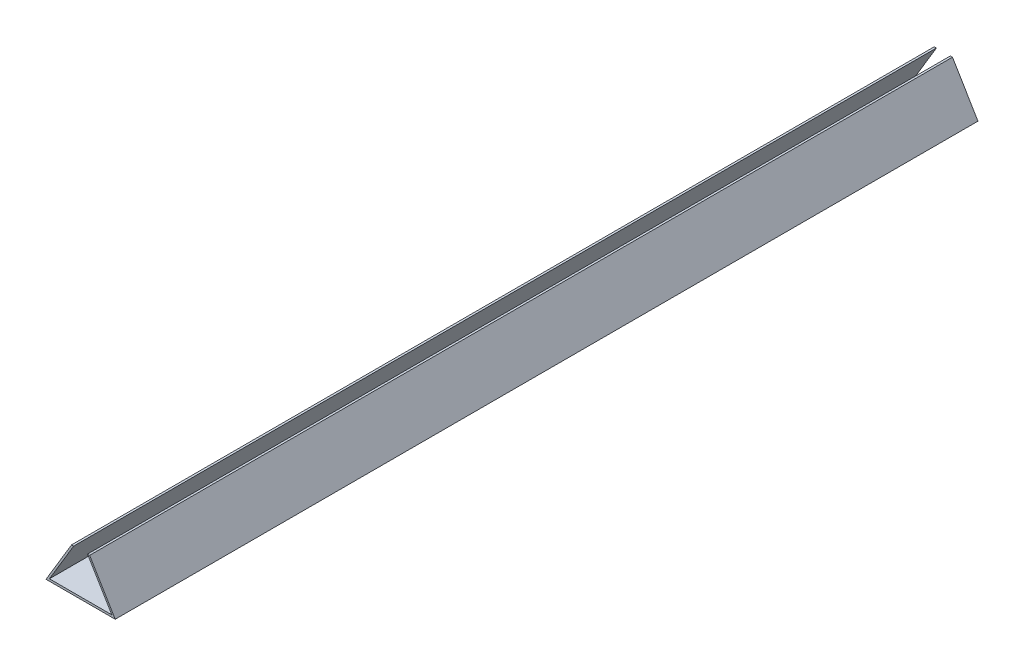
ISO-10303-21;
HEADER;
FILE_DESCRIPTION(('STEP AP214'),'2;1');
FILE_NAME('part.step','',(''),(''),'','','');
FILE_SCHEMA(('AUTOMOTIVE_DESIGN { 1 0 10303 214 1 1 1 1 }'));
ENDSEC;
DATA;
#1=APPLICATION_CONTEXT('core data for automotive mechanical design processes');
#2=APPLICATION_PROTOCOL_DEFINITION('international standard','automotive_design',2000,#1);
#3=PRODUCT_CONTEXT('',#1,'mechanical');
#4=PRODUCT('Part','Part','',(#3));
#5=PRODUCT_RELATED_PRODUCT_CATEGORY('part','',(#4));
#6=PRODUCT_DEFINITION_FORMATION('','',#4);
#7=PRODUCT_DEFINITION_CONTEXT('part definition',#1,'design');
#8=PRODUCT_DEFINITION('design','',#6,#7);
#9=PRODUCT_DEFINITION_SHAPE('','',#8);
#10=(LENGTH_UNIT() NAMED_UNIT(*) SI_UNIT(.MILLI.,.METRE.));
#11=(NAMED_UNIT(*) PLANE_ANGLE_UNIT() SI_UNIT($,.RADIAN.));
#12=(NAMED_UNIT(*) SI_UNIT($,.STERADIAN.) SOLID_ANGLE_UNIT());
#13=UNCERTAINTY_MEASURE_WITH_UNIT(LENGTH_MEASURE(1.E-05),#10,'distance_accuracy_value','');
#14=(GEOMETRIC_REPRESENTATION_CONTEXT(3) GLOBAL_UNCERTAINTY_ASSIGNED_CONTEXT((#13)) GLOBAL_UNIT_ASSIGNED_CONTEXT((#10,
#11,#12)) REPRESENTATION_CONTEXT('',''));
#15=CARTESIAN_POINT('',(0.,0.,0.));
#16=DIRECTION('',(0.,0.,1.));
#17=DIRECTION('',(1.,0.,0.));
#18=AXIS2_PLACEMENT_3D('',#15,#16,#17);
#19=CARTESIAN_POINT('',(-32.5,0.,810.));
#20=DIRECTION('',(0.857492925712544,-0.514495755427526,0.));
#21=DIRECTION('',(0.514495755427526,0.857492925712544,0.));
#22=AXIS2_PLACEMENT_3D('',#19,#20,#21);
#23=PLANE('',#22);
#24=DIRECTION('',(-0.514495755427526,-0.857492925712544,0.));
#25=VECTOR('',#24,1.);
#26=CARTESIAN_POINT('',(-32.5,0.,0.));
#27=LINE('',#26,#25);
#28=CARTESIAN_POINT('',(-8.5,40.,0.));
#29=VERTEX_POINT('',#28);
#30=CARTESIAN_POINT('',(-32.5,0.,0.));
#31=VERTEX_POINT('',#30);
#32=EDGE_CURVE('E129',#29,#31,#27,.T.);
#33=ORIENTED_EDGE('',*,*,#32,.T.);
#34=DIRECTION('',(0.,0.,-1.));
#35=VECTOR('',#34,1.);
#36=CARTESIAN_POINT('',(-32.5,0.,810.));
#37=LINE('',#36,#35);
#38=CARTESIAN_POINT('',(-32.5,0.,810.));
#39=VERTEX_POINT('',#38);
#40=EDGE_CURVE('E11',#39,#31,#37,.T.);
#41=ORIENTED_EDGE('',*,*,#40,.F.);
#42=DIRECTION('',(-0.514495755427526,-0.857492925712544,0.));
#43=VECTOR('',#42,1.);
#44=CARTESIAN_POINT('',(-32.5,0.,810.));
#45=LINE('',#44,#43);
#46=CARTESIAN_POINT('',(-8.5,40.,810.));
#47=VERTEX_POINT('',#46);
#48=EDGE_CURVE('E143',#47,#39,#45,.T.);
#49=ORIENTED_EDGE('',*,*,#48,.F.);
#50=DIRECTION('',(0.,0.,-1.));
#51=VECTOR('',#50,1.);
#52=CARTESIAN_POINT('',(-8.5,40.,810.));
#53=LINE('',#52,#51);
#54=EDGE_CURVE('E125',#47,#29,#53,.T.);
#55=ORIENTED_EDGE('',*,*,#54,.T.);
#56=EDGE_LOOP('',(#33,#41,#49,#55));
#57=FACE_BOUND('',#56,.T.);
#58=ADVANCED_FACE('F33',(#57),#23,.F.);
#59=CARTESIAN_POINT('',(-32.5,0.,810.));
#60=DIRECTION('',(0.,1.,0.));
#61=DIRECTION('',(0.,0.,1.));
#62=AXIS2_PLACEMENT_3D('',#59,#60,#61);
#63=PLANE('',#62);
#64=DIRECTION('',(1.,0.,0.));
#65=VECTOR('',#64,1.);
#66=CARTESIAN_POINT('',(-32.5,0.,0.));
#67=LINE('',#66,#65);
#68=CARTESIAN_POINT('',(32.5,0.,0.));
#69=VERTEX_POINT('',#68);
#70=EDGE_CURVE('E132',#31,#69,#67,.T.);
#71=ORIENTED_EDGE('',*,*,#70,.T.);
#72=DIRECTION('',(0.,0.,-1.));
#73=VECTOR('',#72,1.);
#74=CARTESIAN_POINT('',(32.5,0.,810.));
#75=LINE('',#74,#73);
#76=CARTESIAN_POINT('',(32.5,0.,810.));
#77=VERTEX_POINT('',#76);
#78=EDGE_CURVE('E41',#77,#69,#75,.T.);
#79=ORIENTED_EDGE('',*,*,#78,.F.);
#80=DIRECTION('',(1.,0.,0.));
#81=VECTOR('',#80,1.);
#82=CARTESIAN_POINT('',(-32.5,0.,810.));
#83=LINE('',#82,#81);
#84=EDGE_CURVE('E92',#39,#77,#83,.T.);
#85=ORIENTED_EDGE('',*,*,#84,.F.);
#86=ORIENTED_EDGE('',*,*,#40,.T.);
#87=EDGE_LOOP('',(#71,#79,#85,#86));
#88=FACE_BOUND('',#87,.T.);
#89=ADVANCED_FACE('F178',(#88),#63,.F.);
#90=CARTESIAN_POINT('',(32.5,0.,810.));
#91=DIRECTION('',(-0.857492925712544,-0.514495755427527,0.));
#92=DIRECTION('',(0.514495755427527,-0.857492925712544,0.));
#93=AXIS2_PLACEMENT_3D('',#90,#91,#92);
#94=PLANE('',#93);
#95=DIRECTION('',(-0.514495755427527,0.857492925712544,0.));
#96=VECTOR('',#95,1.);
#97=CARTESIAN_POINT('',(32.5,0.,0.));
#98=LINE('',#97,#96);
#99=CARTESIAN_POINT('',(8.5,40.,0.));
#100=VERTEX_POINT('',#99);
#101=EDGE_CURVE('E134',#69,#100,#98,.T.);
#102=ORIENTED_EDGE('',*,*,#101,.T.);
#103=DIRECTION('',(0.,0.,-1.));
#104=VECTOR('',#103,1.);
#105=CARTESIAN_POINT('',(8.5,40.,810.));
#106=LINE('',#105,#104);
#107=CARTESIAN_POINT('',(8.5,40.,810.));
#108=VERTEX_POINT('',#107);
#109=EDGE_CURVE('E150',#108,#100,#106,.T.);
#110=ORIENTED_EDGE('',*,*,#109,.F.);
#111=DIRECTION('',(-0.514495755427527,0.857492925712544,0.));
#112=VECTOR('',#111,1.);
#113=CARTESIAN_POINT('',(32.5,0.,810.));
#114=LINE('',#113,#112);
#115=EDGE_CURVE('E158',#77,#108,#114,.T.);
#116=ORIENTED_EDGE('',*,*,#115,.F.);
#117=ORIENTED_EDGE('',*,*,#78,.T.);
#118=EDGE_LOOP('',(#102,#110,#116,#117));
#119=FACE_BOUND('',#118,.T.);
#120=ADVANCED_FACE('F156',(#119),#94,.F.);
#121=CARTESIAN_POINT('',(6.5,40.,810.));
#122=DIRECTION('',(0.,-1.,0.));
#123=DIRECTION('',(0.,0.,-1.));
#124=AXIS2_PLACEMENT_3D('',#121,#122,#123);
#125=PLANE('',#124);
#126=DIRECTION('',(-1.,0.,0.));
#127=VECTOR('',#126,1.);
#128=CARTESIAN_POINT('',(6.5,40.,0.));
#129=LINE('',#128,#127);
#130=CARTESIAN_POINT('',(6.5,40.,0.));
#131=VERTEX_POINT('',#130);
#132=EDGE_CURVE('E136',#100,#131,#129,.T.);
#133=ORIENTED_EDGE('',*,*,#132,.T.);
#134=DIRECTION('',(0.,0.,-1.));
#135=VECTOR('',#134,1.);
#136=CARTESIAN_POINT('',(6.5,40.,810.));
#137=LINE('',#136,#135);
#138=CARTESIAN_POINT('',(6.5,40.,810.));
#139=VERTEX_POINT('',#138);
#140=EDGE_CURVE('E147',#139,#131,#137,.T.);
#141=ORIENTED_EDGE('',*,*,#140,.F.);
#142=DIRECTION('',(-1.,0.,0.));
#143=VECTOR('',#142,1.);
#144=CARTESIAN_POINT('',(6.5,40.,810.));
#145=LINE('',#144,#143);
#146=EDGE_CURVE('E170',#108,#139,#145,.T.);
#147=ORIENTED_EDGE('',*,*,#146,.F.);
#148=ORIENTED_EDGE('',*,*,#109,.T.);
#149=EDGE_LOOP('',(#133,#141,#147,#148));
#150=FACE_BOUND('',#149,.T.);
#151=ADVANCED_FACE('F166',(#150),#125,.F.);
#152=CARTESIAN_POINT('',(29.3,2.,810.));
#153=DIRECTION('',(0.857492925712544,0.514495755427527,0.));
#154=DIRECTION('',(-0.514495755427527,0.857492925712544,0.));
#155=AXIS2_PLACEMENT_3D('',#152,#153,#154);
#156=PLANE('',#155);
#157=DIRECTION('',(0.514495755427527,-0.857492925712544,0.));
#158=VECTOR('',#157,1.);
#159=CARTESIAN_POINT('',(29.3,2.,0.));
#160=LINE('',#159,#158);
#161=CARTESIAN_POINT('',(29.3,2.,0.));
#162=VERTEX_POINT('',#161);
#163=EDGE_CURVE('E138',#131,#162,#160,.T.);
#164=ORIENTED_EDGE('',*,*,#163,.T.);
#165=DIRECTION('',(0.,0.,-1.));
#166=VECTOR('',#165,1.);
#167=CARTESIAN_POINT('',(29.3,2.,810.));
#168=LINE('',#167,#166);
#169=CARTESIAN_POINT('',(29.3,2.,810.));
#170=VERTEX_POINT('',#169);
#171=EDGE_CURVE('E120',#170,#162,#168,.T.);
#172=ORIENTED_EDGE('',*,*,#171,.F.);
#173=DIRECTION('',(0.514495755427527,-0.857492925712544,0.));
#174=VECTOR('',#173,1.);
#175=CARTESIAN_POINT('',(29.3,2.,810.));
#176=LINE('',#175,#174);
#177=EDGE_CURVE('E111',#139,#170,#176,.T.);
#178=ORIENTED_EDGE('',*,*,#177,.F.);
#179=ORIENTED_EDGE('',*,*,#140,.T.);
#180=EDGE_LOOP('',(#164,#172,#178,#179));
#181=FACE_BOUND('',#180,.T.);
#182=ADVANCED_FACE('F169',(#181),#156,.F.);
#183=CARTESIAN_POINT('',(-29.3,2.,810.));
#184=DIRECTION('',(0.,-1.,0.));
#185=DIRECTION('',(0.,0.,-1.));
#186=AXIS2_PLACEMENT_3D('',#183,#184,#185);
#187=PLANE('',#186);
#188=DIRECTION('',(-1.,0.,0.));
#189=VECTOR('',#188,1.);
#190=CARTESIAN_POINT('',(-29.3,2.,0.));
#191=LINE('',#190,#189);
#192=CARTESIAN_POINT('',(-29.3,2.,0.));
#193=VERTEX_POINT('',#192);
#194=EDGE_CURVE('E119',#162,#193,#191,.T.);
#195=ORIENTED_EDGE('',*,*,#194,.T.);
#196=DIRECTION('',(0.,0.,-1.));
#197=VECTOR('',#196,1.);
#198=CARTESIAN_POINT('',(-29.3,2.,810.));
#199=LINE('',#198,#197);
#200=CARTESIAN_POINT('',(-29.3,2.,810.));
#201=VERTEX_POINT('',#200);
#202=EDGE_CURVE('E116',#201,#193,#199,.T.);
#203=ORIENTED_EDGE('',*,*,#202,.F.);
#204=DIRECTION('',(-1.,0.,0.));
#205=VECTOR('',#204,1.);
#206=CARTESIAN_POINT('',(-29.3,2.,810.));
#207=LINE('',#206,#205);
#208=EDGE_CURVE('E105',#170,#201,#207,.T.);
#209=ORIENTED_EDGE('',*,*,#208,.F.);
#210=ORIENTED_EDGE('',*,*,#171,.T.);
#211=EDGE_LOOP('',(#195,#203,#209,#210));
#212=FACE_BOUND('',#211,.T.);
#213=ADVANCED_FACE('F117',(#212),#187,.F.);
#214=CARTESIAN_POINT('',(-6.50000000000001,40.,810.));
#215=DIRECTION('',(-0.857492925712544,0.514495755427526,0.));
#216=DIRECTION('',(-0.514495755427526,-0.857492925712544,0.));
#217=AXIS2_PLACEMENT_3D('',#214,#215,#216);
#218=PLANE('',#217);
#219=DIRECTION('',(0.514495755427526,0.857492925712544,0.));
#220=VECTOR('',#219,1.);
#221=CARTESIAN_POINT('',(-6.50000000000001,40.,0.));
#222=LINE('',#221,#220);
#223=CARTESIAN_POINT('',(-6.50000000000001,40.,0.));
#224=VERTEX_POINT('',#223);
#225=EDGE_CURVE('E78',#193,#224,#222,.T.);
#226=ORIENTED_EDGE('',*,*,#225,.T.);
#227=DIRECTION('',(0.,0.,-1.));
#228=VECTOR('',#227,1.);
#229=CARTESIAN_POINT('',(-6.50000000000001,40.,810.));
#230=LINE('',#229,#228);
#231=CARTESIAN_POINT('',(-6.50000000000001,40.,810.));
#232=VERTEX_POINT('',#231);
#233=EDGE_CURVE('E121',#232,#224,#230,.T.);
#234=ORIENTED_EDGE('',*,*,#233,.F.);
#235=DIRECTION('',(0.514495755427526,0.857492925712544,0.));
#236=VECTOR('',#235,1.);
#237=CARTESIAN_POINT('',(-6.50000000000001,40.,810.));
#238=LINE('',#237,#236);
#239=EDGE_CURVE('E109',#201,#232,#238,.T.);
#240=ORIENTED_EDGE('',*,*,#239,.F.);
#241=ORIENTED_EDGE('',*,*,#202,.T.);
#242=EDGE_LOOP('',(#226,#234,#240,#241));
#243=FACE_BOUND('',#242,.T.);
#244=ADVANCED_FACE('F123',(#243),#218,.F.);
#245=CARTESIAN_POINT('',(-6.50000000000001,40.,810.));
#246=DIRECTION('',(0.,-1.,0.));
#247=DIRECTION('',(0.,0.,-1.));
#248=AXIS2_PLACEMENT_3D('',#245,#246,#247);
#249=PLANE('',#248);
#250=DIRECTION('',(-1.,0.,0.));
#251=VECTOR('',#250,1.);
#252=CARTESIAN_POINT('',(-6.50000000000001,40.,0.));
#253=LINE('',#252,#251);
#254=EDGE_CURVE('E84',#224,#29,#253,.T.);
#255=ORIENTED_EDGE('',*,*,#254,.T.);
#256=ORIENTED_EDGE('',*,*,#54,.F.);
#257=DIRECTION('',(-1.,0.,0.));
#258=VECTOR('',#257,1.);
#259=CARTESIAN_POINT('',(-6.50000000000001,40.,810.));
#260=LINE('',#259,#258);
#261=EDGE_CURVE('E49',#232,#47,#260,.T.);
#262=ORIENTED_EDGE('',*,*,#261,.F.);
#263=ORIENTED_EDGE('',*,*,#233,.T.);
#264=EDGE_LOOP('',(#255,#256,#262,#263));
#265=FACE_BOUND('',#264,.T.);
#266=ADVANCED_FACE('F194',(#265),#249,.F.);
#267=CARTESIAN_POINT('',(0.,0.,810.));
#268=DIRECTION('',(0.,0.,1.));
#269=DIRECTION('',(1.,0.,0.));
#270=AXIS2_PLACEMENT_3D('',#267,#268,#269);
#271=PLANE('',#270);
#272=ORIENTED_EDGE('',*,*,#48,.T.);
#273=ORIENTED_EDGE('',*,*,#84,.T.);
#274=ORIENTED_EDGE('',*,*,#115,.T.);
#275=ORIENTED_EDGE('',*,*,#146,.T.);
#276=ORIENTED_EDGE('',*,*,#177,.T.);
#277=ORIENTED_EDGE('',*,*,#208,.T.);
#278=ORIENTED_EDGE('',*,*,#239,.T.);
#279=ORIENTED_EDGE('',*,*,#261,.T.);
#280=EDGE_LOOP('',(#272,#273,#274,#275,#276,#277,#278,#279));
#281=FACE_BOUND('',#280,.T.);
#282=ADVANCED_FACE('F107',(#281),#271,.T.);
#283=CARTESIAN_POINT('',(0.,0.,0.));
#284=DIRECTION('',(0.,0.,1.));
#285=DIRECTION('',(1.,0.,0.));
#286=AXIS2_PLACEMENT_3D('',#283,#284,#285);
#287=PLANE('',#286);
#288=ORIENTED_EDGE('',*,*,#32,.F.);
#289=ORIENTED_EDGE('',*,*,#254,.F.);
#290=ORIENTED_EDGE('',*,*,#225,.F.);
#291=ORIENTED_EDGE('',*,*,#194,.F.);
#292=ORIENTED_EDGE('',*,*,#163,.F.);
#293=ORIENTED_EDGE('',*,*,#132,.F.);
#294=ORIENTED_EDGE('',*,*,#101,.F.);
#295=ORIENTED_EDGE('',*,*,#70,.F.);
#296=EDGE_LOOP('',(#288,#289,#290,#291,#292,#293,#294,#295));
#297=FACE_BOUND('',#296,.T.);
#298=ADVANCED_FACE('F162',(#297),#287,.F.);
#299=CLOSED_SHELL('',(#58,#89,#120,#151,#182,#213,#244,#266,#282,#298));
#300=MANIFOLD_SOLID_BREP('B2',#299);
#301=ADVANCED_BREP_SHAPE_REPRESENTATION('',(#18,#300),#14);
#302=SHAPE_DEFINITION_REPRESENTATION(#9,#301);
ENDSEC;
END-ISO-10303-21;
